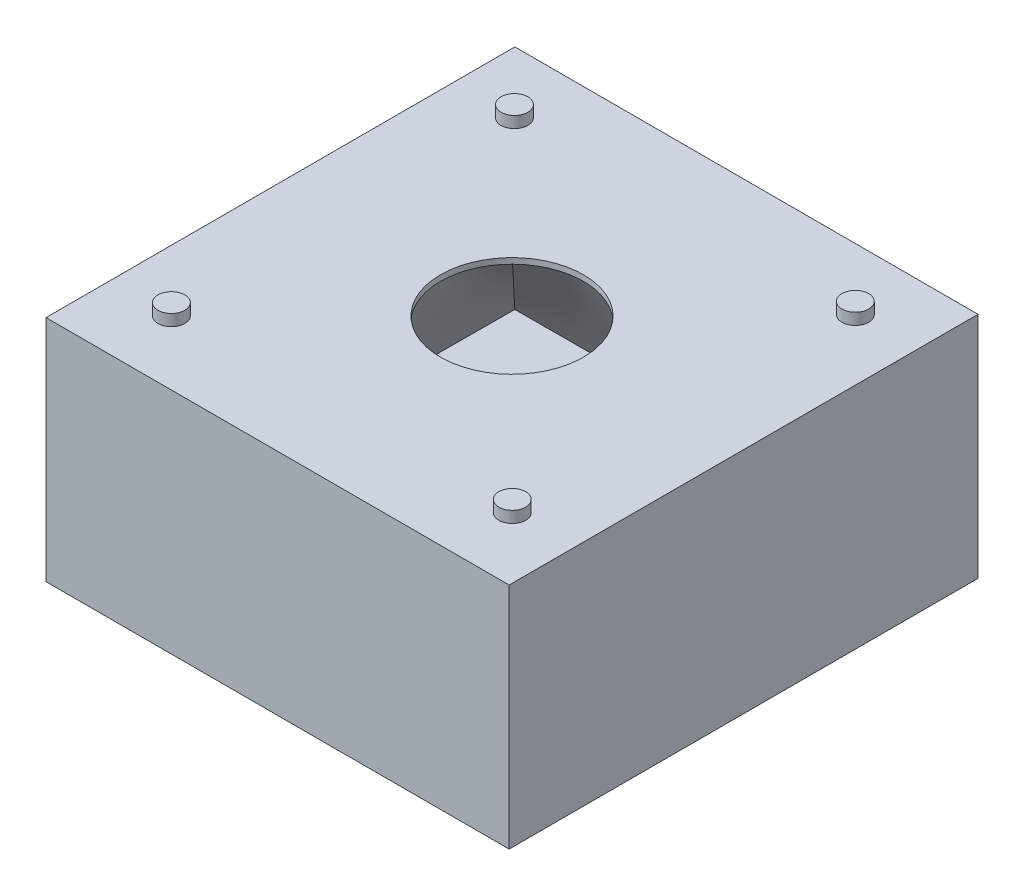
ISO-10303-21;
HEADER;
FILE_DESCRIPTION(('STEP AP214'),'2;1');
FILE_NAME('part.step','',(''),(''),'','','');
FILE_SCHEMA(('AUTOMOTIVE_DESIGN { 1 0 10303 214 1 1 1 1 }'));
ENDSEC;
DATA;
#1=APPLICATION_CONTEXT('core data for automotive mechanical design processes');
#2=APPLICATION_PROTOCOL_DEFINITION('international standard','automotive_design',2000,#1);
#3=PRODUCT_CONTEXT('',#1,'mechanical');
#4=PRODUCT('Part','Part','',(#3));
#5=PRODUCT_RELATED_PRODUCT_CATEGORY('part','',(#4));
#6=PRODUCT_DEFINITION_FORMATION('','',#4);
#7=PRODUCT_DEFINITION_CONTEXT('part definition',#1,'design');
#8=PRODUCT_DEFINITION('design','',#6,#7);
#9=PRODUCT_DEFINITION_SHAPE('','',#8);
#10=(LENGTH_UNIT() NAMED_UNIT(*) SI_UNIT(.MILLI.,.METRE.));
#11=(NAMED_UNIT(*) PLANE_ANGLE_UNIT() SI_UNIT($,.RADIAN.));
#12=(NAMED_UNIT(*) SI_UNIT($,.STERADIAN.) SOLID_ANGLE_UNIT());
#13=UNCERTAINTY_MEASURE_WITH_UNIT(LENGTH_MEASURE(1.E-05),#10,'distance_accuracy_value','');
#14=(GEOMETRIC_REPRESENTATION_CONTEXT(3) GLOBAL_UNCERTAINTY_ASSIGNED_CONTEXT((#13)) GLOBAL_UNIT_ASSIGNED_CONTEXT((#10,
#11,#12)) REPRESENTATION_CONTEXT('',''));
#15=CARTESIAN_POINT('',(0.,0.,0.));
#16=DIRECTION('',(0.,0.,1.));
#17=DIRECTION('',(1.,0.,0.));
#18=AXIS2_PLACEMENT_3D('',#15,#16,#17);
#19=CARTESIAN_POINT('',(-102.87,-50.8,208.28));
#20=DIRECTION('',(1.,0.,0.));
#21=DIRECTION('',(0.,0.,-1.));
#22=AXIS2_PLACEMENT_3D('',#19,#20,#21);
#23=PLANE('',#22);
#24=DIRECTION('',(0.,-1.,0.));
#25=VECTOR('',#24,1.);
#26=CARTESIAN_POINT('',(-102.87,-50.8,0.));
#27=LINE('',#26,#25);
#28=CARTESIAN_POINT('',(-102.87,50.8,0.));
#29=VERTEX_POINT('',#28);
#30=CARTESIAN_POINT('',(-102.87,-50.8,0.));
#31=VERTEX_POINT('',#30);
#32=EDGE_CURVE('E107',#29,#31,#27,.T.);
#33=ORIENTED_EDGE('',*,*,#32,.T.);
#34=DIRECTION('',(0.,0.,-1.));
#35=VECTOR('',#34,1.);
#36=CARTESIAN_POINT('',(-102.87,-50.8,208.28));
#37=LINE('',#36,#35);
#38=CARTESIAN_POINT('',(-102.87,-50.8,208.28));
#39=VERTEX_POINT('',#38);
#40=EDGE_CURVE('E128',#31,#39,#37,.F.);
#41=ORIENTED_EDGE('',*,*,#40,.T.);
#42=DIRECTION('',(0.,-1.,0.));
#43=VECTOR('',#42,1.);
#44=CARTESIAN_POINT('',(-102.87,-50.8,208.28));
#45=LINE('',#44,#43);
#46=CARTESIAN_POINT('',(-102.87,50.8,208.28));
#47=VERTEX_POINT('',#46);
#48=EDGE_CURVE('E114',#47,#39,#45,.T.);
#49=ORIENTED_EDGE('',*,*,#48,.F.);
#50=DIRECTION('',(0.,0.,-1.));
#51=VECTOR('',#50,1.);
#52=CARTESIAN_POINT('',(-102.87,50.8,208.28));
#53=LINE('',#52,#51);
#54=EDGE_CURVE('E279',#47,#29,#53,.T.);
#55=ORIENTED_EDGE('',*,*,#54,.T.);
#56=EDGE_LOOP('',(#33,#41,#49,#55));
#57=FACE_BOUND('',#56,.T.);
#58=ADVANCED_FACE('F69',(#57),#23,.F.);
#59=CARTESIAN_POINT('',(102.87,-50.8,208.28));
#60=DIRECTION('',(-1.,0.,0.));
#61=DIRECTION('',(0.,0.,1.));
#62=AXIS2_PLACEMENT_3D('',#59,#60,#61);
#63=PLANE('',#62);
#64=DIRECTION('',(0.,0.,-1.));
#65=VECTOR('',#64,1.);
#66=CARTESIAN_POINT('',(102.87,50.8,208.28));
#67=LINE('',#66,#65);
#68=CARTESIAN_POINT('',(102.87,50.8,208.28));
#69=VERTEX_POINT('',#68);
#70=CARTESIAN_POINT('',(102.87,50.8,0.));
#71=VERTEX_POINT('',#70);
#72=EDGE_CURVE('E142',#69,#71,#67,.T.);
#73=ORIENTED_EDGE('',*,*,#72,.F.);
#74=DIRECTION('',(0.,1.,0.));
#75=VECTOR('',#74,1.);
#76=CARTESIAN_POINT('',(102.87,-50.8,208.28));
#77=LINE('',#76,#75);
#78=CARTESIAN_POINT('',(102.87,-50.8,208.28));
#79=VERTEX_POINT('',#78);
#80=EDGE_CURVE('E133',#79,#69,#77,.T.);
#81=ORIENTED_EDGE('',*,*,#80,.F.);
#82=DIRECTION('',(0.,0.,1.));
#83=VECTOR('',#82,1.);
#84=CARTESIAN_POINT('',(102.87,-50.8,208.28));
#85=LINE('',#84,#83);
#86=CARTESIAN_POINT('',(102.87,-50.8,0.));
#87=VERTEX_POINT('',#86);
#88=EDGE_CURVE('E131',#79,#87,#85,.F.);
#89=ORIENTED_EDGE('',*,*,#88,.T.);
#90=DIRECTION('',(0.,1.,0.));
#91=VECTOR('',#90,1.);
#92=CARTESIAN_POINT('',(102.87,-50.8,0.));
#93=LINE('',#92,#91);
#94=EDGE_CURVE('E147',#87,#71,#93,.T.);
#95=ORIENTED_EDGE('',*,*,#94,.T.);
#96=EDGE_LOOP('',(#73,#81,#89,#95));
#97=FACE_BOUND('',#96,.T.);
#98=ADVANCED_FACE('F315',(#97),#63,.F.);
#99=CARTESIAN_POINT('',(102.87,50.8,208.28));
#100=DIRECTION('',(0.,-1.,0.));
#101=DIRECTION('',(1.,0.,0.));
#102=AXIS2_PLACEMENT_3D('',#99,#100,#101);
#103=PLANE('',#102);
#104=CARTESIAN_POINT('',(75.7131373578771,50.8,179.731491013884));
#105=DIRECTION('',(0.,-1.,0.));
#106=DIRECTION('',(1.,0.,0.));
#107=AXIS2_PLACEMENT_3D('',#104,#105,#106);
#108=CIRCLE('',#107,5.94999999999999);
#109=CARTESIAN_POINT('',(81.6631373578771,50.8,179.731491013884));
#110=VERTEX_POINT('',#109);
#111=EDGE_CURVE('E12',#110,#110,#108,.F.);
#112=ORIENTED_EDGE('',*,*,#111,.F.);
#113=EDGE_LOOP('',(#112));
#114=FACE_BOUND('',#113,.T.);
#115=CARTESIAN_POINT('',(-75.7131373578772,50.8,179.731491013884));
#116=DIRECTION('',(0.,-1.,0.));
#117=DIRECTION('',(1.,0.,0.));
#118=AXIS2_PLACEMENT_3D('',#115,#116,#117);
#119=CIRCLE('',#118,5.94999999999999);
#120=CARTESIAN_POINT('',(-69.7631373578772,50.8,179.731491013884));
#121=VERTEX_POINT('',#120);
#122=EDGE_CURVE('E78',#121,#121,#119,.F.);
#123=ORIENTED_EDGE('',*,*,#122,.F.);
#124=EDGE_LOOP('',(#123));
#125=FACE_BOUND('',#124,.T.);
#126=CARTESIAN_POINT('',(-75.7131373578771,50.8,27.3314910138837));
#127=DIRECTION('',(0.,-1.,0.));
#128=DIRECTION('',(1.,0.,0.));
#129=AXIS2_PLACEMENT_3D('',#126,#127,#128);
#130=CIRCLE('',#129,5.94999999999999);
#131=CARTESIAN_POINT('',(-69.7631373578771,50.8,27.3314910138837));
#132=VERTEX_POINT('',#131);
#133=EDGE_CURVE('E421',#132,#132,#130,.F.);
#134=ORIENTED_EDGE('',*,*,#133,.F.);
#135=EDGE_LOOP('',(#134));
#136=FACE_BOUND('',#135,.T.);
#137=CARTESIAN_POINT('',(75.7131373578772,50.8,27.3314910138838));
#138=DIRECTION('',(0.,-1.,0.));
#139=DIRECTION('',(1.,0.,0.));
#140=AXIS2_PLACEMENT_3D('',#137,#138,#139);
#141=CIRCLE('',#140,5.94999999999999);
#142=CARTESIAN_POINT('',(81.6631373578772,50.8,27.3314910138838));
#143=VERTEX_POINT('',#142);
#144=EDGE_CURVE('E140',#143,#143,#141,.F.);
#145=ORIENTED_EDGE('',*,*,#144,.F.);
#146=EDGE_LOOP('',(#145));
#147=FACE_BOUND('',#146,.T.);
#148=CARTESIAN_POINT('',(0.,50.8,104.14));
#149=DIRECTION('',(0.,1.,0.));
#150=DIRECTION('',(-1.,0.,0.));
#151=AXIS2_PLACEMENT_3D('',#148,#149,#150);
#152=CIRCLE('',#151,31.75);
#153=CARTESIAN_POINT('',(-31.75,50.8,104.14));
#154=VERTEX_POINT('',#153);
#155=EDGE_CURVE('E267',#154,#154,#152,.T.);
#156=ORIENTED_EDGE('',*,*,#155,.F.);
#157=EDGE_LOOP('',(#156));
#158=FACE_BOUND('',#157,.T.);
#159=DIRECTION('',(-1.,0.,0.));
#160=VECTOR('',#159,1.);
#161=CARTESIAN_POINT('',(102.87,50.8,0.));
#162=LINE('',#161,#160);
#163=EDGE_CURVE('E124',#71,#29,#162,.T.);
#164=ORIENTED_EDGE('',*,*,#163,.T.);
#165=ORIENTED_EDGE('',*,*,#54,.F.);
#166=DIRECTION('',(-1.,0.,0.));
#167=VECTOR('',#166,1.);
#168=CARTESIAN_POINT('',(102.87,50.8,208.28));
#169=LINE('',#168,#167);
#170=EDGE_CURVE('E121',#69,#47,#169,.T.);
#171=ORIENTED_EDGE('',*,*,#170,.F.);
#172=ORIENTED_EDGE('',*,*,#72,.T.);
#173=EDGE_LOOP('',(#164,#165,#171,#172));
#174=FACE_BOUND('',#173,.T.);
#175=ADVANCED_FACE('F310',(#114,#125,#136,#147,#158,#174),#103,.F.);
#176=CARTESIAN_POINT('',(0.,0.,208.28));
#177=DIRECTION('',(0.,0.,1.));
#178=DIRECTION('',(1.,0.,0.));
#179=AXIS2_PLACEMENT_3D('',#176,#177,#178);
#180=PLANE('',#179);
#181=ORIENTED_EDGE('',*,*,#48,.T.);
#182=DIRECTION('',(1.,0.,0.));
#183=VECTOR('',#182,1.);
#184=CARTESIAN_POINT('',(0.,-50.8,208.28));
#185=LINE('',#184,#183);
#186=EDGE_CURVE('E118',#39,#79,#185,.T.);
#187=ORIENTED_EDGE('',*,*,#186,.T.);
#188=ORIENTED_EDGE('',*,*,#80,.T.);
#189=ORIENTED_EDGE('',*,*,#170,.T.);
#190=EDGE_LOOP('',(#181,#187,#188,#189));
#191=FACE_BOUND('',#190,.T.);
#192=ADVANCED_FACE('F116',(#191),#180,.T.);
#193=CARTESIAN_POINT('',(0.,0.,0.));
#194=DIRECTION('',(0.,0.,1.));
#195=DIRECTION('',(1.,0.,0.));
#196=AXIS2_PLACEMENT_3D('',#193,#194,#195);
#197=PLANE('',#196);
#198=ORIENTED_EDGE('',*,*,#163,.F.);
#199=ORIENTED_EDGE('',*,*,#94,.F.);
#200=DIRECTION('',(1.,0.,0.));
#201=VECTOR('',#200,1.);
#202=CARTESIAN_POINT('',(0.,-50.8,0.));
#203=LINE('',#202,#201);
#204=EDGE_CURVE('E146',#87,#31,#203,.F.);
#205=ORIENTED_EDGE('',*,*,#204,.T.);
#206=ORIENTED_EDGE('',*,*,#32,.F.);
#207=EDGE_LOOP('',(#198,#199,#205,#206));
#208=FACE_BOUND('',#207,.T.);
#209=ADVANCED_FACE('F307',(#208),#197,.F.);
#210=CARTESIAN_POINT('',(0.,48.2599999999996,104.14));
#211=DIRECTION('',(0.,1.,0.));
#212=DIRECTION('',(-1.,0.,0.));
#213=AXIS2_PLACEMENT_3D('',#210,#211,#212);
#214=CYLINDRICAL_SURFACE('',#213,31.75);
#215=CARTESIAN_POINT('',(-22.3124864200438,48.2599999999996,126.727949215353));
#216=CARTESIAN_POINT('',(-20.9896693331037,48.2599999999996,128.034634386599));
#217=CARTESIAN_POINT('',(-19.5026846645386,48.2599999999997,129.272581282519));
#218=CARTESIAN_POINT('',(-16.2210852817355,48.2599999999996,131.505630694897));
#219=CARTESIAN_POINT('',(-14.4263189789052,48.2599999999996,132.500025355683));
#220=CARTESIAN_POINT('',(-10.5936593119883,48.2599999999996,134.143068173732));
#221=CARTESIAN_POINT('',(-8.5560637504088,48.2599999999996,134.790933949171));
#222=CARTESIAN_POINT('',(-4.34530202494424,48.2599999999996,135.664662237199));
#223=CARTESIAN_POINT('',(-2.17288731621915,48.2599999999996,135.89));
#224=CARTESIAN_POINT('',(2.17288731621906,48.2599999999996,135.89));
#225=CARTESIAN_POINT('',(4.34530202494415,48.2599999999996,135.664662237199));
#226=CARTESIAN_POINT('',(8.55606375040871,48.2599999999996,134.790933949171));
#227=CARTESIAN_POINT('',(10.5936593119882,48.2599999999996,134.143068173732));
#228=CARTESIAN_POINT('',(14.4263189789051,48.2599999999996,132.500025355683));
#229=CARTESIAN_POINT('',(16.2210852817354,48.2599999999996,131.505630694897));
#230=CARTESIAN_POINT('',(19.5026846645385,48.2599999999997,129.272581282519));
#231=CARTESIAN_POINT('',(20.9896693331036,48.2599999999996,128.034634386599));
#232=CARTESIAN_POINT('',(22.3124864200437,48.2599999999996,126.727949215353));
#233=B_SPLINE_CURVE_WITH_KNOTS('',3,(#215,#216,#217,#218,#219,#220,#221,#222,#223,#224,#225,
#226,#227,#228,#229,#230,#231,#232),.UNSPECIFIED.,.F.,.F.,(4,2,2,2,2,2,2,2,4),(0.,0.125,0.25,
0.375,0.5,0.625,0.75,0.875,1.),.UNSPECIFIED.);
#234=CARTESIAN_POINT('',(-22.3124864200438,48.2599999999996,126.727949215353));
#235=VERTEX_POINT('',#234);
#236=CARTESIAN_POINT('',(22.3124868510645,48.2599999999996,126.727949638193));
#237=VERTEX_POINT('',#236);
#238=EDGE_CURVE('E262',#235,#237,#233,.T.);
#239=ORIENTED_EDGE('',*,*,#238,.F.);
#240=CARTESIAN_POINT('',(0.,48.2599999999996,104.14));
#241=DIRECTION('',(0.,1.,0.));
#242=DIRECTION('',(-1.,0.,0.));
#243=AXIS2_PLACEMENT_3D('',#240,#241,#242);
#244=CIRCLE('',#243,31.75);
#245=CARTESIAN_POINT('',(-22.3124864200438,48.2599999999996,81.552050784647));
#246=VERTEX_POINT('',#245);
#247=EDGE_CURVE('E167',#246,#235,#244,.T.);
#248=ORIENTED_EDGE('',*,*,#247,.F.);
#249=CARTESIAN_POINT('',(22.3124864200437,48.2599999999996,81.5520507846471));
#250=VERTEX_POINT('',#249);
#251=EDGE_CURVE('E169',#250,#246,#244,.T.);
#252=ORIENTED_EDGE('',*,*,#251,.F.);
#253=EDGE_CURVE('E162',#237,#250,#244,.T.);
#254=ORIENTED_EDGE('',*,*,#253,.F.);
#255=EDGE_LOOP('',(#239,#248,#252,#254));
#256=FACE_BOUND('',#255,.T.);
#257=ORIENTED_EDGE('',*,*,#155,.T.);
#258=EDGE_LOOP('',(#257));
#259=FACE_BOUND('',#258,.T.);
#260=ADVANCED_FACE('F298',(#256,#259),#214,.F.);
#261=CARTESIAN_POINT('',(-22.3124864200438,48.2599999999996,126.727949215353));
#262=CARTESIAN_POINT('',(-102.87,-50.8,208.28));
#263=CARTESIAN_POINT('',(-23.6516345821314,48.2599999999996,125.405132128413));
#264=CARTESIAN_POINT('',(-102.87,-50.8,199.601666666667));
#265=CARTESIAN_POINT('',(-24.9233029119905,48.2599999999996,123.912318616134));
#266=CARTESIAN_POINT('',(-102.87,-50.8,190.923333333333));
#267=CARTESIAN_POINT('',(-27.2211299045404,48.2599999999996,120.605895002121));
#268=CARTESIAN_POINT('',(-102.87,-50.8,173.566666666667));
#269=CARTESIAN_POINT('',(-28.2465289706315,48.2599999999996,118.792099047174));
#270=CARTESIAN_POINT('',(-102.87,-50.8,164.888333333333));
#271=CARTESIAN_POINT('',(-29.942745176086,48.2599999999996,114.90951329898));
#272=CARTESIAN_POINT('',(-102.87,-50.8,147.531666666667));
#273=CARTESIAN_POINT('',(-30.612706769427,48.2599999999996,112.841029442538));
#274=CARTESIAN_POINT('',(-102.87,-50.8,138.853333333333));
#275=CARTESIAN_POINT('',(-31.5166240817102,48.2599999999996,108.561327357593));
#276=CARTESIAN_POINT('',(-102.87,-50.8,121.496666666667));
#277=CARTESIAN_POINT('',(-31.75,48.2599999999996,106.350921210737));
#278=CARTESIAN_POINT('',(-102.87,-50.8,112.818333333333));
#279=CARTESIAN_POINT('',(-31.75,48.2599999999996,101.929078789263));
#280=CARTESIAN_POINT('',(-102.87,-50.8,95.4616666666668));
#281=CARTESIAN_POINT('',(-31.5166240817102,48.2599999999996,99.7186726424069));
#282=CARTESIAN_POINT('',(-102.87,-50.8,86.7833333333334));
#283=CARTESIAN_POINT('',(-30.612706769427,48.2599999999996,95.4389705574619));
#284=CARTESIAN_POINT('',(-102.87,-50.8,69.4266666666668));
#285=CARTESIAN_POINT('',(-29.942745176086,48.2599999999996,93.3704867010197));
#286=CARTESIAN_POINT('',(-102.87,-50.8,60.7483333333334));
#287=CARTESIAN_POINT('',(-28.2465289706315,48.2599999999996,89.4879009528255));
#288=CARTESIAN_POINT('',(-102.87,-50.8,43.3916666666667));
#289=CARTESIAN_POINT('',(-27.2211299045404,48.2599999999996,87.6741049978786));
#290=CARTESIAN_POINT('',(-102.87,-50.8,34.7133333333334));
#291=CARTESIAN_POINT('',(-24.9233029119905,48.2599999999997,84.367681383866));
#292=CARTESIAN_POINT('',(-102.87,-50.8,17.3566666666667));
#293=CARTESIAN_POINT('',(-23.6516345821314,48.2599999999996,82.8748678715872));
#294=CARTESIAN_POINT('',(-102.87,-50.8,8.67833333333335));
#295=CARTESIAN_POINT('',(-22.3124864200438,48.2599999999996,81.552050784647));
#296=CARTESIAN_POINT('',(-102.87,-50.8,0.));
#297=B_SPLINE_SURFACE_WITH_KNOTS('',3,1,((#261,#262),(#263,#264),(#265,#266),(#267,#268),(#269,
#270),(#271,#272),(#273,#274),(#275,#276),(#277,#278),(#279,#280),(#281,#282),(#283,#284),(#285,
#286),(#287,#288),(#289,#290),(#291,#292),(#293,#294),(#295,#296)),.UNSPECIFIED.,.F.,.F.,.F.,(4,
2,2,2,2,2,2,2,4),(2,2),(0.,0.125,0.25,0.375,0.5,0.625,0.75,0.875,1.),(0.,1.),.UNSPECIFIED.);
#298=DIRECTION('',(0.531722528273485,0.653848800813495,-0.538287003931182));
#299=VECTOR('',#298,1.);
#300=CARTESIAN_POINT('',(-62.5912432100219,-1.27000000000019,167.503974607676));
#301=LINE('',#300,#299);
#302=CARTESIAN_POINT('',(-100.288028410899,-47.625,205.666152218441));
#303=VERTEX_POINT('',#302);
#304=EDGE_CURVE('E192',#303,#235,#301,.T.);
#305=CARTESIAN_POINT('',(-100.288028410899,-47.625,205.666152218441));
#306=CARTESIAN_POINT('',(-100.311232304964,-47.625,201.101146028381));
#307=CARTESIAN_POINT('',(-100.333801995485,-47.625,196.536136643224));
#308=CARTESIAN_POINT('',(-100.377104678389,-47.625,187.406108208649));
#309=CARTESIAN_POINT('',(-100.397837670374,-47.625,182.841089159229));
#310=CARTESIAN_POINT('',(-100.456429160586,-47.625,169.146012330831));
#311=CARTESIAN_POINT('',(-100.490680155764,-47.625,160.015938117631));
#312=CARTESIAN_POINT('',(-100.531675324698,-47.625,146.32079000851));
#313=CARTESIAN_POINT('',(-100.543610164715,-47.625,141.755731566423));
#314=CARTESIAN_POINT('',(-100.563623487361,-47.625,132.625605963638));
#315=CARTESIAN_POINT('',(-100.571701969887,-47.625,128.06053880294));
#316=CARTESIAN_POINT('',(-100.583705785994,-47.625,118.930399909557));
#317=CARTESIAN_POINT('',(-100.587631120442,-47.625,114.365328176873));
#318=CARTESIAN_POINT('',(-100.591178550563,-47.625,105.235183300622));
#319=CARTESIAN_POINT('',(-100.590800646484,-47.625,100.670110157056));
#320=CARTESIAN_POINT('',(-100.585421789111,-47.625,90.9110588109553));
#321=CARTESIAN_POINT('',(-100.579791113531,-47.625,85.717080948868));
#322=CARTESIAN_POINT('',(-100.563229906766,-47.625,75.3291326873995));
#323=CARTESIAN_POINT('',(-100.55229937441,-47.625,70.1351622880202));
#324=CARTESIAN_POINT('',(-100.525674960587,-47.625,59.7472320648528));
#325=CARTESIAN_POINT('',(-100.509981077453,-47.625,54.553272241069));
#326=CARTESIAN_POINT('',(-100.474486429882,-47.625,44.1653553102449));
#327=CARTESIAN_POINT('',(-100.454685656354,-47.625,38.9713982032361));
#328=CARTESIAN_POINT('',(-100.411785498228,-47.625,28.583499546671));
#329=CARTESIAN_POINT('',(-100.388686114713,-47.625,23.3895579971101));
#330=CARTESIAN_POINT('',(-100.340009983121,-47.625,13.0016920197413));
#331=CARTESIAN_POINT('',(-100.314433237704,-47.625,7.80776759192095));
#332=CARTESIAN_POINT('',(-100.288028410899,-47.625,2.6138477815592));
#333=B_SPLINE_CURVE_WITH_KNOTS('',3,(#305,#306,#307,#308,#309,#310,#311,#312,#313,#314,#315,
#316,#317,#318,#319,#320,#321,#322,#323,#324,#325,#326,#327,#328,#329,#330,#331,#332),
.UNSPECIFIED.,.F.,.F.,(4,2,2,2,2,2,2,2,2,2,2,2,2,4),(0.,13.6951952729705,27.3903935192685,
54.780799749758,68.4760205099563,82.1712416384575,95.8664599094263,109.561677393348,
125.143617199637,140.725560448162,156.307509150789,171.889492346096,187.471470424818,
203.053431768394),.UNSPECIFIED.);
#334=CARTESIAN_POINT('',(-100.288028410899,-47.625,2.61384778155919));
#335=VERTEX_POINT('',#334);
#336=EDGE_CURVE('E168',#303,#335,#333,.T.);
#337=DIRECTION('',(-0.531722528273485,-0.653848800813495,-0.538287003931182));
#338=VECTOR('',#337,1.);
#339=CARTESIAN_POINT('',(-62.5912432100219,-1.27000000000019,40.7760253923235));
#340=LINE('',#339,#338);
#341=EDGE_CURVE('E344',#246,#335,#340,.T.);
#342=ORIENTED_EDGE('',*,*,#304,.F.);
#343=ORIENTED_EDGE('',*,*,#336,.T.);
#344=ORIENTED_EDGE('',*,*,#341,.F.);
#345=ORIENTED_EDGE('',*,*,#247,.T.);
#346=EDGE_LOOP('',(#342,#343,#344,#345));
#347=FACE_BOUND('',#346,.T.);
#348=ADVANCED_FACE('F230',(#347),#297,.F.);
#349=CARTESIAN_POINT('',(-22.3124864200438,48.2599999999996,81.552050784647));
#350=CARTESIAN_POINT('',(-102.87,-50.8,0.));
#351=CARTESIAN_POINT('',(-20.9896693331036,48.2599999999996,80.2453656134013));
#352=CARTESIAN_POINT('',(-94.2975,-50.8,0.));
#353=CARTESIAN_POINT('',(-19.5026846645385,48.2599999999997,79.0074187174813));
#354=CARTESIAN_POINT('',(-85.725,-50.8,0.));
#355=CARTESIAN_POINT('',(-16.2210852817355,48.2599999999996,76.7743693051028));
#356=CARTESIAN_POINT('',(-68.58,-50.8,0.));
#357=CARTESIAN_POINT('',(-14.4263189789052,48.2599999999996,75.7799746443172));
#358=CARTESIAN_POINT('',(-60.0075,-50.8,0.));
#359=CARTESIAN_POINT('',(-10.5936593119883,48.2599999999996,74.1369318262679));
#360=CARTESIAN_POINT('',(-42.8625,-50.8,0.));
#361=CARTESIAN_POINT('',(-8.5560637504088,48.2599999999996,73.4890660508293));
#362=CARTESIAN_POINT('',(-34.29,-50.8,0.));
#363=CARTESIAN_POINT('',(-4.34530202494423,48.2599999999996,72.6153377628007));
#364=CARTESIAN_POINT('',(-17.145,-50.8,0.));
#365=CARTESIAN_POINT('',(-2.17288731621914,48.2599999999996,72.39));
#366=CARTESIAN_POINT('',(-8.5725,-50.8,0.));
#367=CARTESIAN_POINT('',(2.17288731621907,48.2599999999996,72.39));
#368=CARTESIAN_POINT('',(8.5725,-50.8,0.));
#369=CARTESIAN_POINT('',(4.34530202494416,48.2599999999996,72.6153377628007));
#370=CARTESIAN_POINT('',(17.145,-50.8,0.));
#371=CARTESIAN_POINT('',(8.55606375040872,48.2599999999996,73.4890660508293));
#372=CARTESIAN_POINT('',(34.29,-50.8,0.));
#373=CARTESIAN_POINT('',(10.5936593119882,48.2599999999996,74.1369318262679));
#374=CARTESIAN_POINT('',(42.8625,-50.8,0.));
#375=CARTESIAN_POINT('',(14.4263189789051,48.2599999999996,75.7799746443172));
#376=CARTESIAN_POINT('',(60.0075,-50.8,0.));
#377=CARTESIAN_POINT('',(16.2210852817354,48.2599999999996,76.7743693051028));
#378=CARTESIAN_POINT('',(68.58,-50.8,0.));
#379=CARTESIAN_POINT('',(19.5026846645385,48.2599999999997,79.0074187174813));
#380=CARTESIAN_POINT('',(85.725,-50.8,0.));
#381=CARTESIAN_POINT('',(20.9896693331036,48.2599999999996,80.2453656134013));
#382=CARTESIAN_POINT('',(94.2975,-50.8,0.));
#383=CARTESIAN_POINT('',(22.3124864200437,48.2599999999996,81.5520507846471));
#384=CARTESIAN_POINT('',(102.87,-50.8,0.));
#385=B_SPLINE_SURFACE_WITH_KNOTS('',3,1,((#349,#350),(#351,#352),(#353,#354),(#355,#356),(#357,
#358),(#359,#360),(#361,#362),(#363,#364),(#365,#366),(#367,#368),(#369,#370),(#371,#372),(#373,
#374),(#375,#376),(#377,#378),(#379,#380),(#381,#382),(#383,#384)),.UNSPECIFIED.,.F.,.F.,.F.,(4,
2,2,2,2,2,2,2,4),(2,2),(0.,0.125,0.25,0.375,0.5,0.625,0.75,0.875,1.),(0.,1.),.UNSPECIFIED.);
#386=CARTESIAN_POINT('',(-100.288028410899,-47.625,2.61384778155919));
#387=CARTESIAN_POINT('',(-95.5280478860368,-47.625,2.58995105374691));
#388=CARTESIAN_POINT('',(-90.768063783922,-47.625,2.5667715944129));
#389=CARTESIAN_POINT('',(-81.2480849804893,-47.625,2.52248816168484));
#390=CARTESIAN_POINT('',(-76.4880902791694,-47.625,2.50138418872305));
#391=CARTESIAN_POINT('',(-62.2080855784519,-47.625,2.44214692756326));
#392=CARTESIAN_POINT('',(-52.6880574872797,-47.625,2.40808831034134));
#393=CARTESIAN_POINT('',(-38.407976762,-47.625,2.36856702526004));
#394=CARTESIAN_POINT('',(-33.6479400121126,-47.625,2.35732103311149));
#395=CARTESIAN_POINT('',(-24.1278580465648,-47.625,2.33911001614613));
#396=CARTESIAN_POINT('',(-19.3678128309041,-47.625,2.33214499143819));
#397=CARTESIAN_POINT('',(-9.84771872969463,-47.625,2.32274094865324));
#398=CARTESIAN_POINT('',(-5.08766984414671,-47.625,2.32030192976621));
#399=CARTESIAN_POINT('',(4.43242803132163,-47.625,2.32009006527462));
#400=CARTESIAN_POINT('',(9.19247702124205,-47.625,2.32231721966736));
#401=CARTESIAN_POINT('',(18.7489646347423,-47.625,2.33133839080849));
#402=CARTESIAN_POINT('',(23.54540322504,-47.625,2.33816719430055));
#403=CARTESIAN_POINT('',(33.1382728874474,-47.625,2.35619139367489));
#404=CARTESIAN_POINT('',(37.9347039595557,-47.625,2.36738679027614));
#405=CARTESIAN_POINT('',(47.5275565267954,-47.625,2.39368934607785));
#406=CARTESIAN_POINT('',(52.3239780219238,-47.625,2.40879650633142));
#407=CARTESIAN_POINT('',(61.9168163096504,-47.625,2.44238814702347));
#408=CARTESIAN_POINT('',(66.7132331022305,-47.625,2.46087263256672));
#409=CARTESIAN_POINT('',(76.3060538839357,-47.625,2.50059340479518));
#410=CARTESIAN_POINT('',(81.1024578730639,-47.625,2.52182969076449));
#411=CARTESIAN_POINT('',(90.6952520425216,-47.625,2.56641447148137));
#412=CARTESIAN_POINT('',(95.4916422228594,-47.625,2.58976296445041));
#413=CARTESIAN_POINT('',(100.288028410899,-47.625,2.6138477815592));
#414=B_SPLINE_CURVE_WITH_KNOTS('',3,(#386,#387,#388,#389,#390,#391,#392,#393,#394,#395,#396,
#397,#398,#399,#400,#401,#402,#403,#404,#405,#406,#407,#408,#409,#410,#411,#412,#413),
.UNSPECIFIED.,.F.,.F.,(4,2,2,2,2,2,2,2,2,2,2,2,2,4),(0.,14.280121288798,28.5602455517255,
57.1205015926333,71.4006500733165,85.6807989172002,99.9609452053798,114.241091485308,
128.630419720087,143.019750324106,157.40908480201,171.798441029407,186.187793513405,
200.577133881279),.UNSPECIFIED.);
#415=CARTESIAN_POINT('',(100.288028410899,-47.625,2.6138477815592));
#416=VERTEX_POINT('',#415);
#417=EDGE_CURVE('E216',#335,#416,#414,.T.);
#418=DIRECTION('',(0.531722528273485,-0.653848800813495,-0.538287003931182));
#419=VECTOR('',#418,1.);
#420=CARTESIAN_POINT('',(62.5912432100219,-1.27000000000017,40.7760253923235));
#421=LINE('',#420,#419);
#422=EDGE_CURVE('E347',#250,#416,#421,.T.);
#423=ORIENTED_EDGE('',*,*,#341,.T.);
#424=ORIENTED_EDGE('',*,*,#417,.T.);
#425=ORIENTED_EDGE('',*,*,#422,.F.);
#426=ORIENTED_EDGE('',*,*,#251,.T.);
#427=EDGE_LOOP('',(#423,#424,#425,#426));
#428=FACE_BOUND('',#427,.T.);
#429=ADVANCED_FACE('F224',(#428),#385,.F.);
#430=CARTESIAN_POINT('',(22.3124864200437,48.2599999999996,126.727949215353));
#431=CARTESIAN_POINT('',(102.87,-50.8,208.28));
#432=CARTESIAN_POINT('',(20.9896693331036,48.2599999999996,128.034634386599));
#433=CARTESIAN_POINT('',(94.2975,-50.8,208.28));
#434=CARTESIAN_POINT('',(19.5026846645385,48.2599999999997,129.272581282519));
#435=CARTESIAN_POINT('',(85.725,-50.8,208.28));
#436=CARTESIAN_POINT('',(16.2210852817354,48.2599999999996,131.505630694897));
#437=CARTESIAN_POINT('',(68.58,-50.8,208.28));
#438=CARTESIAN_POINT('',(14.4263189789051,48.2599999999996,132.500025355683));
#439=CARTESIAN_POINT('',(60.0075,-50.8,208.28));
#440=CARTESIAN_POINT('',(10.5936593119882,48.2599999999996,134.143068173732));
#441=CARTESIAN_POINT('',(42.8625,-50.8,208.28));
#442=CARTESIAN_POINT('',(8.55606375040871,48.2599999999996,134.790933949171));
#443=CARTESIAN_POINT('',(34.29,-50.8,208.28));
#444=CARTESIAN_POINT('',(4.34530202494415,48.2599999999996,135.664662237199));
#445=CARTESIAN_POINT('',(17.145,-50.8,208.28));
#446=CARTESIAN_POINT('',(2.17288731621906,48.2599999999996,135.89));
#447=CARTESIAN_POINT('',(8.57250000000003,-50.8,208.28));
#448=CARTESIAN_POINT('',(-2.17288731621915,48.2599999999996,135.89));
#449=CARTESIAN_POINT('',(-8.57249999999997,-50.8,208.28));
#450=CARTESIAN_POINT('',(-4.34530202494424,48.2599999999996,135.664662237199));
#451=CARTESIAN_POINT('',(-17.145,-50.8,208.28));
#452=CARTESIAN_POINT('',(-8.5560637504088,48.2599999999996,134.790933949171));
#453=CARTESIAN_POINT('',(-34.29,-50.8,208.28));
#454=CARTESIAN_POINT('',(-10.5936593119883,48.2599999999996,134.143068173732));
#455=CARTESIAN_POINT('',(-42.8625,-50.8,208.28));
#456=CARTESIAN_POINT('',(-14.4263189789052,48.2599999999996,132.500025355683));
#457=CARTESIAN_POINT('',(-60.0075,-50.8,208.28));
#458=CARTESIAN_POINT('',(-16.2210852817355,48.2599999999996,131.505630694897));
#459=CARTESIAN_POINT('',(-68.58,-50.8,208.28));
#460=CARTESIAN_POINT('',(-19.5026846645386,48.2599999999997,129.272581282519));
#461=CARTESIAN_POINT('',(-85.725,-50.8,208.28));
#462=CARTESIAN_POINT('',(-20.9896693331037,48.2599999999996,128.034634386599));
#463=CARTESIAN_POINT('',(-94.2975,-50.8,208.28));
#464=CARTESIAN_POINT('',(-22.3124864200438,48.2599999999996,126.727949215353));
#465=CARTESIAN_POINT('',(-102.87,-50.8,208.28));
#466=B_SPLINE_SURFACE_WITH_KNOTS('',3,1,((#430,#431),(#432,#433),(#434,#435),(#436,#437),(#438,
#439),(#440,#441),(#442,#443),(#444,#445),(#446,#447),(#448,#449),(#450,#451),(#452,#453),(#454,
#455),(#456,#457),(#458,#459),(#460,#461),(#462,#463),(#464,#465)),.UNSPECIFIED.,.F.,.F.,.F.,(4,
2,2,2,2,2,2,2,4),(2,2),(0.,0.125,0.25,0.375,0.5,0.625,0.75,0.875,1.),(0.,1.),.UNSPECIFIED.);
#467=DIRECTION('',(0.531722528273485,-0.653848800813495,0.538287003931182));
#468=VECTOR('',#467,1.);
#469=CARTESIAN_POINT('',(62.5912432100218,-1.27000000000017,167.503974607676));
#470=LINE('',#469,#468);
#471=CARTESIAN_POINT('',(100.288028410899,-47.625,205.666152218441));
#472=VERTEX_POINT('',#471);
#473=EDGE_CURVE('E276',#237,#472,#470,.T.);
#474=CARTESIAN_POINT('',(100.288028410899,-47.625,205.666152218441));
#475=CARTESIAN_POINT('',(95.5280478860391,-47.625,205.690048946253));
#476=CARTESIAN_POINT('',(90.7680637839267,-47.625,205.713228405587));
#477=CARTESIAN_POINT('',(81.2480849804987,-47.625,205.757511838315));
#478=CARTESIAN_POINT('',(76.4880902791812,-47.625,205.778615811277));
#479=CARTESIAN_POINT('',(62.2080855784708,-47.625,205.837853072437));
#480=CARTESIAN_POINT('',(52.6880574873034,-47.625,205.871911689659));
#481=CARTESIAN_POINT('',(38.4079767620308,-47.625,205.91143297474));
#482=CARTESIAN_POINT('',(33.6479400121458,-47.625,205.922678966888));
#483=CARTESIAN_POINT('',(24.1278580466027,-47.625,205.940889983854));
#484=CARTESIAN_POINT('',(19.3678128309444,-47.625,205.947855008562));
#485=CARTESIAN_POINT('',(9.84771872973969,-47.625,205.957259051347));
#486=CARTESIAN_POINT('',(5.08766984419414,-47.625,205.959698070234));
#487=CARTESIAN_POINT('',(-4.43242803126945,-47.625,205.959909934725));
#488=CARTESIAN_POINT('',(-9.19247702118749,-47.625,205.957682780333));
#489=CARTESIAN_POINT('',(-18.7489646346886,-47.625,205.948661609192));
#490=CARTESIAN_POINT('',(-23.5454032249894,-47.625,205.941832805699));
#491=CARTESIAN_POINT('',(-33.1382728874031,-47.625,205.923808606325));
#492=CARTESIAN_POINT('',(-37.9347039595146,-47.625,205.912613209724));
#493=CARTESIAN_POINT('',(-47.5275565267606,-47.625,205.886310653922));
#494=CARTESIAN_POINT('',(-52.3239780218922,-47.625,205.871203493669));
#495=CARTESIAN_POINT('',(-61.9168163096251,-47.625,205.837611852977));
#496=CARTESIAN_POINT('',(-66.7132331022083,-47.625,205.819127367433));
#497=CARTESIAN_POINT('',(-76.3060538839199,-47.625,205.779406595205));
#498=CARTESIAN_POINT('',(-81.1024578730512,-47.625,205.758170309236));
#499=CARTESIAN_POINT('',(-90.6952520425153,-47.625,205.713585528519));
#500=CARTESIAN_POINT('',(-95.4916422228563,-47.625,205.69023703555));
#501=CARTESIAN_POINT('',(-100.288028410899,-47.625,205.666152218441));
#502=B_SPLINE_CURVE_WITH_KNOTS('',3,(#474,#475,#476,#477,#478,#479,#480,#481,#482,#483,#484,
#485,#486,#487,#488,#489,#490,#491,#492,#493,#494,#495,#496,#497,#498,#499,#500,#501),
.UNSPECIFIED.,.F.,.F.,(4,2,2,2,2,2,2,2,2,2,2,2,2,4),(0.,14.2801212887908,28.5602455517113,
57.1205015926048,71.4006500732809,85.6807989171574,99.96094520533,114.241091485251,
128.630419720039,143.019750324068,157.409084801982,171.798441029388,186.187793513395,
200.577133881279),.UNSPECIFIED.);
#503=EDGE_CURVE('E86',#472,#303,#502,.T.);
#504=ORIENTED_EDGE('',*,*,#473,.T.);
#505=ORIENTED_EDGE('',*,*,#503,.T.);
#506=ORIENTED_EDGE('',*,*,#304,.T.);
#507=ORIENTED_EDGE('',*,*,#238,.T.);
#508=EDGE_LOOP('',(#504,#505,#506,#507));
#509=FACE_BOUND('',#508,.T.);
#510=ADVANCED_FACE('F229',(#509),#466,.F.);
#511=CARTESIAN_POINT('',(22.3124864200437,48.2599999999996,81.5520507846471));
#512=CARTESIAN_POINT('',(102.87,-50.8,0.));
#513=CARTESIAN_POINT('',(23.6516345821313,48.2599999999996,82.8748678715872));
#514=CARTESIAN_POINT('',(102.87,-50.8,8.67833333333334));
#515=CARTESIAN_POINT('',(24.9233029119904,48.2599999999996,84.3676813838661));
#516=CARTESIAN_POINT('',(102.87,-50.8,17.3566666666667));
#517=CARTESIAN_POINT('',(27.2211299045404,48.2599999999996,87.6741049978786));
#518=CARTESIAN_POINT('',(102.87,-50.8,34.7133333333333));
#519=CARTESIAN_POINT('',(28.2465289706314,48.2599999999996,89.4879009528256));
#520=CARTESIAN_POINT('',(102.87,-50.8,43.3916666666667));
#521=CARTESIAN_POINT('',(29.9427451760859,48.2599999999996,93.3704867010197));
#522=CARTESIAN_POINT('',(102.87,-50.8,60.7483333333334));
#523=CARTESIAN_POINT('',(30.6127067694269,48.2599999999996,95.4389705574619));
#524=CARTESIAN_POINT('',(102.87,-50.8,69.4266666666667));
#525=CARTESIAN_POINT('',(31.5166240817101,48.2599999999996,99.7186726424069));
#526=CARTESIAN_POINT('',(102.87,-50.8,86.7833333333334));
#527=CARTESIAN_POINT('',(31.75,48.2599999999996,101.929078789263));
#528=CARTESIAN_POINT('',(102.87,-50.8,95.4616666666667));
#529=CARTESIAN_POINT('',(31.75,48.2599999999996,106.350921210737));
#530=CARTESIAN_POINT('',(102.87,-50.8,112.818333333333));
#531=CARTESIAN_POINT('',(31.5166240817101,48.2599999999996,108.561327357593));
#532=CARTESIAN_POINT('',(102.87,-50.8,121.496666666667));
#533=CARTESIAN_POINT('',(30.6127067694269,48.2599999999996,112.841029442538));
#534=CARTESIAN_POINT('',(102.87,-50.8,138.853333333333));
#535=CARTESIAN_POINT('',(29.9427451760859,48.2599999999996,114.90951329898));
#536=CARTESIAN_POINT('',(102.87,-50.8,147.531666666667));
#537=CARTESIAN_POINT('',(28.2465289706314,48.2599999999996,118.792099047174));
#538=CARTESIAN_POINT('',(102.87,-50.8,164.888333333333));
#539=CARTESIAN_POINT('',(27.2211299045404,48.2599999999996,120.605895002121));
#540=CARTESIAN_POINT('',(102.87,-50.8,173.566666666667));
#541=CARTESIAN_POINT('',(24.9233029119904,48.2599999999997,123.912318616134));
#542=CARTESIAN_POINT('',(102.87,-50.8,190.923333333333));
#543=CARTESIAN_POINT('',(23.6516345821313,48.2599999999996,125.405132128413));
#544=CARTESIAN_POINT('',(102.87,-50.8,199.601666666667));
#545=CARTESIAN_POINT('',(22.3124864200437,48.2599999999996,126.727949215353));
#546=CARTESIAN_POINT('',(102.87,-50.8,208.28));
#547=B_SPLINE_SURFACE_WITH_KNOTS('',3,1,((#511,#512),(#513,#514),(#515,#516),(#517,#518),(#519,
#520),(#521,#522),(#523,#524),(#525,#526),(#527,#528),(#529,#530),(#531,#532),(#533,#534),(#535,
#536),(#537,#538),(#539,#540),(#541,#542),(#543,#544),(#545,#546)),.UNSPECIFIED.,.F.,.F.,.F.,(4,
2,2,2,2,2,2,2,4),(2,2),(0.,0.125,0.25,0.375,0.5,0.625,0.75,0.875,1.),(0.,1.),.UNSPECIFIED.);
#548=CARTESIAN_POINT('',(100.288028410899,-47.625,2.6138477815592));
#549=CARTESIAN_POINT('',(100.311232304964,-47.625,7.17885397161624));
#550=CARTESIAN_POINT('',(100.333801995485,-47.625,11.7438633567706));
#551=CARTESIAN_POINT('',(100.377104678389,-47.625,20.8738917913401));
#552=CARTESIAN_POINT('',(100.397837670374,-47.625,25.4389108407572));
#553=CARTESIAN_POINT('',(100.456429160586,-47.625,39.1339876691481));
#554=CARTESIAN_POINT('',(100.490680155764,-47.625,48.264061882342));
#555=CARTESIAN_POINT('',(100.531675324698,-47.625,61.9592099914558));
#556=CARTESIAN_POINT('',(100.543610164715,-47.625,66.52426843354));
#557=CARTESIAN_POINT('',(100.563623487361,-47.625,75.6543940363193));
#558=CARTESIAN_POINT('',(100.571701969887,-47.625,80.2194611970147));
#559=CARTESIAN_POINT('',(100.583705785994,-47.625,89.3496000903927));
#560=CARTESIAN_POINT('',(100.587631120442,-47.625,93.9146718230742));
#561=CARTESIAN_POINT('',(100.591178550563,-47.625,103.044816699319));
#562=CARTESIAN_POINT('',(100.590800646484,-47.625,107.609889842883));
#563=CARTESIAN_POINT('',(100.585421789111,-47.625,117.368941188984));
#564=CARTESIAN_POINT('',(100.579791113531,-47.625,122.562919051075));
#565=CARTESIAN_POINT('',(100.563229906766,-47.625,132.950867312551));
#566=CARTESIAN_POINT('',(100.55229937441,-47.625,138.144837711934));
#567=CARTESIAN_POINT('',(100.525674960587,-47.625,148.532767935108));
#568=CARTESIAN_POINT('',(100.509981077453,-47.625,153.726727758896));
#569=CARTESIAN_POINT('',(100.474486429882,-47.625,164.114644689727));
#570=CARTESIAN_POINT('',(100.454685656354,-47.625,169.308601796739));
#571=CARTESIAN_POINT('',(100.411785498228,-47.625,179.696500453311));
#572=CARTESIAN_POINT('',(100.388686114713,-47.625,184.890442002876));
#573=CARTESIAN_POINT('',(100.340009983121,-47.625,195.278307980252));
#574=CARTESIAN_POINT('',(100.314433237704,-47.625,200.472232408075));
#575=CARTESIAN_POINT('',(100.288028410899,-47.625,205.666152218441));
#576=B_SPLINE_CURVE_WITH_KNOTS('',3,(#548,#549,#550,#551,#552,#553,#554,#555,#556,#557,#558,
#559,#560,#561,#562,#563,#564,#565,#566,#567,#568,#569,#570,#571,#572,#573,#574,#575),
.UNSPECIFIED.,.F.,.F.,(4,2,2,2,2,2,2,2,2,2,2,2,2,4),(0.,13.6951952729625,27.3903935192525,
54.7807997497261,68.4760205099164,82.1712416384096,95.8664599093705,109.561677393284,
125.143617199584,140.725560448119,156.307509150757,171.889492346075,187.471470424808,
203.053431768394),.UNSPECIFIED.);
#577=EDGE_CURVE('E136',#416,#472,#576,.T.);
#578=ORIENTED_EDGE('',*,*,#422,.T.);
#579=ORIENTED_EDGE('',*,*,#577,.T.);
#580=ORIENTED_EDGE('',*,*,#473,.F.);
#581=ORIENTED_EDGE('',*,*,#253,.T.);
#582=EDGE_LOOP('',(#578,#579,#580,#581));
#583=FACE_BOUND('',#582,.T.);
#584=ADVANCED_FACE('F194',(#583),#547,.F.);
#585=CARTESIAN_POINT('',(0.,-50.8,0.));
#586=DIRECTION('',(0.,1.,0.));
#587=DIRECTION('',(-1.,0.,0.));
#588=AXIS2_PLACEMENT_3D('',#585,#586,#587);
#589=PLANE('',#588);
#590=ORIENTED_EDGE('',*,*,#88,.F.);
#591=ORIENTED_EDGE('',*,*,#186,.F.);
#592=ORIENTED_EDGE('',*,*,#40,.F.);
#593=ORIENTED_EDGE('',*,*,#204,.F.);
#594=EDGE_LOOP('',(#590,#591,#592,#593));
#595=FACE_BOUND('',#594,.T.);
#596=ADVANCED_FACE('F127',(#595),#589,.F.);
#597=CARTESIAN_POINT('',(0.,-47.625,0.));
#598=DIRECTION('',(0.,1.,0.));
#599=DIRECTION('',(-1.,0.,0.));
#600=AXIS2_PLACEMENT_3D('',#597,#598,#599);
#601=PLANE('',#600);
#602=ORIENTED_EDGE('',*,*,#336,.F.);
#603=ORIENTED_EDGE('',*,*,#503,.F.);
#604=ORIENTED_EDGE('',*,*,#577,.F.);
#605=ORIENTED_EDGE('',*,*,#417,.F.);
#606=EDGE_LOOP('',(#602,#603,#604,#605));
#607=FACE_BOUND('',#606,.T.);
#608=ADVANCED_FACE('F200',(#607),#601,.T.);
#609=CARTESIAN_POINT('',(75.7131373578772,55.88,27.3314910138838));
#610=DIRECTION('',(0.,-1.,0.));
#611=DIRECTION('',(1.,0.,0.));
#612=AXIS2_PLACEMENT_3D('',#609,#610,#611);
#613=CYLINDRICAL_SURFACE('',#612,5.94999999999999);
#614=CARTESIAN_POINT('',(75.7131373578772,55.88,27.3314910138838));
#615=DIRECTION('',(0.,1.,0.));
#616=DIRECTION('',(-1.,0.,0.));
#617=AXIS2_PLACEMENT_3D('',#614,#615,#616);
#618=CIRCLE('',#617,5.94999999999999);
#619=CARTESIAN_POINT('',(69.7631373578772,55.88,27.3314910138838));
#620=VERTEX_POINT('',#619);
#621=EDGE_CURVE('E390',#620,#620,#618,.T.);
#622=ORIENTED_EDGE('',*,*,#621,.F.);
#623=EDGE_LOOP('',(#622));
#624=FACE_BOUND('',#623,.T.);
#625=ORIENTED_EDGE('',*,*,#144,.T.);
#626=EDGE_LOOP('',(#625));
#627=FACE_BOUND('',#626,.T.);
#628=ADVANCED_FACE('F205',(#624,#627),#613,.T.);
#629=CARTESIAN_POINT('',(75.7131373578772,55.88,27.3314910138838));
#630=DIRECTION('',(0.,1.,0.));
#631=DIRECTION('',(-1.,0.,0.));
#632=AXIS2_PLACEMENT_3D('',#629,#630,#631);
#633=PLANE('',#632);
#634=ORIENTED_EDGE('',*,*,#621,.T.);
#635=EDGE_LOOP('',(#634));
#636=FACE_BOUND('',#635,.T.);
#637=ADVANCED_FACE('F449',(#636),#633,.T.);
#638=CARTESIAN_POINT('',(-75.7131373578771,55.88,27.3314910138837));
#639=DIRECTION('',(0.,-1.,0.));
#640=DIRECTION('',(1.,0.,0.));
#641=AXIS2_PLACEMENT_3D('',#638,#639,#640);
#642=CYLINDRICAL_SURFACE('',#641,5.94999999999999);
#643=CARTESIAN_POINT('',(-75.7131373578771,55.88,27.3314910138837));
#644=DIRECTION('',(0.,1.,0.));
#645=DIRECTION('',(-1.,0.,0.));
#646=AXIS2_PLACEMENT_3D('',#643,#644,#645);
#647=CIRCLE('',#646,5.94999999999999);
#648=CARTESIAN_POINT('',(-81.6631373578771,55.88,27.3314910138837));
#649=VERTEX_POINT('',#648);
#650=EDGE_CURVE('E393',#649,#649,#647,.T.);
#651=ORIENTED_EDGE('',*,*,#650,.F.);
#652=EDGE_LOOP('',(#651));
#653=FACE_BOUND('',#652,.T.);
#654=ORIENTED_EDGE('',*,*,#133,.T.);
#655=EDGE_LOOP('',(#654));
#656=FACE_BOUND('',#655,.T.);
#657=ADVANCED_FACE('F443',(#653,#656),#642,.T.);
#658=CARTESIAN_POINT('',(-75.7131373578771,55.88,27.3314910138837));
#659=DIRECTION('',(0.,1.,0.));
#660=DIRECTION('',(-1.,0.,0.));
#661=AXIS2_PLACEMENT_3D('',#658,#659,#660);
#662=PLANE('',#661);
#663=ORIENTED_EDGE('',*,*,#650,.T.);
#664=EDGE_LOOP('',(#663));
#665=FACE_BOUND('',#664,.T.);
#666=ADVANCED_FACE('F434',(#665),#662,.T.);
#667=CARTESIAN_POINT('',(-75.7131373578772,55.88,179.731491013884));
#668=DIRECTION('',(0.,-1.,0.));
#669=DIRECTION('',(1.,0.,0.));
#670=AXIS2_PLACEMENT_3D('',#667,#668,#669);
#671=CYLINDRICAL_SURFACE('',#670,5.94999999999999);
#672=CARTESIAN_POINT('',(-75.7131373578772,55.88,179.731491013884));
#673=DIRECTION('',(0.,1.,0.));
#674=DIRECTION('',(-1.,0.,0.));
#675=AXIS2_PLACEMENT_3D('',#672,#673,#674);
#676=CIRCLE('',#675,5.94999999999999);
#677=CARTESIAN_POINT('',(-81.6631373578772,55.88,179.731491013884));
#678=VERTEX_POINT('',#677);
#679=EDGE_CURVE('E396',#678,#678,#676,.T.);
#680=ORIENTED_EDGE('',*,*,#679,.F.);
#681=EDGE_LOOP('',(#680));
#682=FACE_BOUND('',#681,.T.);
#683=ORIENTED_EDGE('',*,*,#122,.T.);
#684=EDGE_LOOP('',(#683));
#685=FACE_BOUND('',#684,.T.);
#686=ADVANCED_FACE('F432',(#682,#685),#671,.T.);
#687=CARTESIAN_POINT('',(-75.7131373578772,55.88,179.731491013884));
#688=DIRECTION('',(0.,1.,0.));
#689=DIRECTION('',(-1.,0.,0.));
#690=AXIS2_PLACEMENT_3D('',#687,#688,#689);
#691=PLANE('',#690);
#692=ORIENTED_EDGE('',*,*,#679,.T.);
#693=EDGE_LOOP('',(#692));
#694=FACE_BOUND('',#693,.T.);
#695=ADVANCED_FACE('F411',(#694),#691,.T.);
#696=CARTESIAN_POINT('',(75.7131373578771,55.88,179.731491013884));
#697=DIRECTION('',(0.,-1.,0.));
#698=DIRECTION('',(1.,0.,0.));
#699=AXIS2_PLACEMENT_3D('',#696,#697,#698);
#700=CYLINDRICAL_SURFACE('',#699,5.94999999999999);
#701=CARTESIAN_POINT('',(75.7131373578771,55.88,179.731491013884));
#702=DIRECTION('',(0.,1.,0.));
#703=DIRECTION('',(-1.,0.,0.));
#704=AXIS2_PLACEMENT_3D('',#701,#702,#703);
#705=CIRCLE('',#704,5.94999999999999);
#706=CARTESIAN_POINT('',(69.7631373578771,55.88,179.731491013884));
#707=VERTEX_POINT('',#706);
#708=EDGE_CURVE('E400',#707,#707,#705,.T.);
#709=ORIENTED_EDGE('',*,*,#708,.F.);
#710=EDGE_LOOP('',(#709));
#711=FACE_BOUND('',#710,.T.);
#712=ORIENTED_EDGE('',*,*,#111,.T.);
#713=EDGE_LOOP('',(#712));
#714=FACE_BOUND('',#713,.T.);
#715=ADVANCED_FACE('F408',(#711,#714),#700,.T.);
#716=CARTESIAN_POINT('',(75.7131373578771,55.88,179.731491013884));
#717=DIRECTION('',(0.,1.,0.));
#718=DIRECTION('',(-1.,0.,0.));
#719=AXIS2_PLACEMENT_3D('',#716,#717,#718);
#720=PLANE('',#719);
#721=ORIENTED_EDGE('',*,*,#708,.T.);
#722=EDGE_LOOP('',(#721));
#723=FACE_BOUND('',#722,.T.);
#724=ADVANCED_FACE('F406',(#723),#720,.T.);
#725=CLOSED_SHELL('',(#58,#98,#175,#192,#209,#260,#348,#429,#510,#584,#596,#608,#628,#637,#657,
#666,#686,#695,#715,#724));
#726=MANIFOLD_SOLID_BREP('B2',#725);
#727=ADVANCED_BREP_SHAPE_REPRESENTATION('',(#18,#726),#14);
#728=SHAPE_DEFINITION_REPRESENTATION(#9,#727);
ENDSEC;
END-ISO-10303-21;
